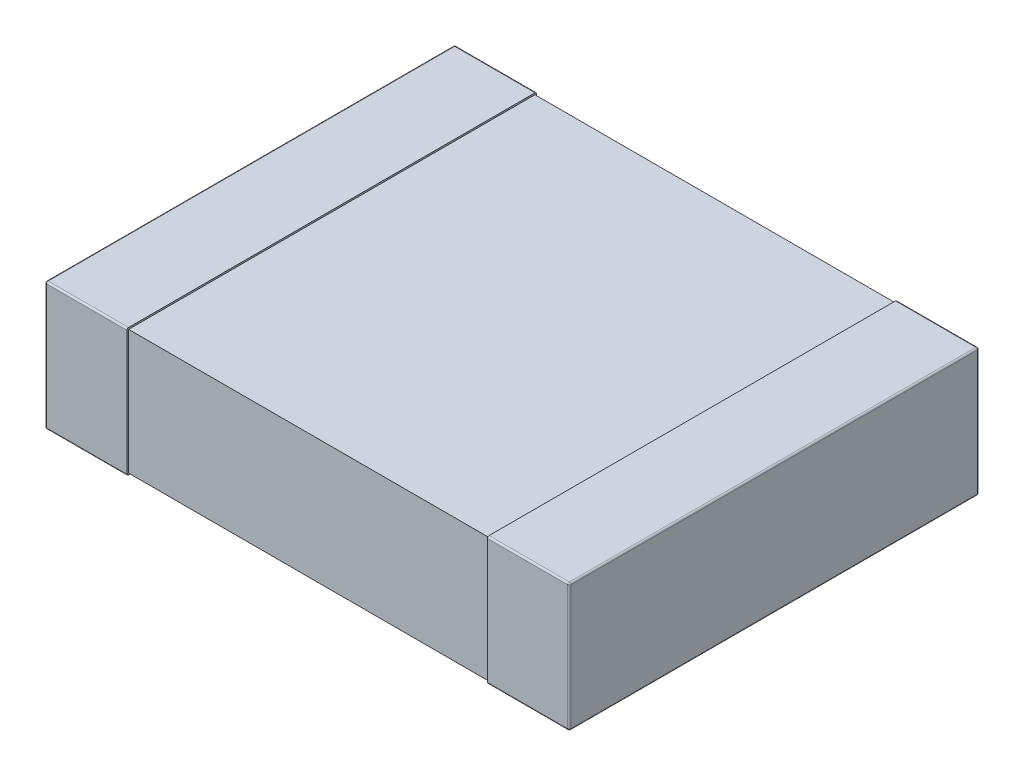
ISO-10303-21;
HEADER;
FILE_DESCRIPTION(('STEP AP214'),'2;1');
FILE_NAME('part.step','',(''),(''),'','','');
FILE_SCHEMA(('AUTOMOTIVE_DESIGN { 1 0 10303 214 1 1 1 1 }'));
ENDSEC;
DATA;
#1=APPLICATION_CONTEXT('core data for automotive mechanical design processes');
#2=APPLICATION_PROTOCOL_DEFINITION('international standard','automotive_design',2000,#1);
#3=PRODUCT_CONTEXT('',#1,'mechanical');
#4=PRODUCT('Part','Part','',(#3));
#5=PRODUCT_RELATED_PRODUCT_CATEGORY('part','',(#4));
#6=PRODUCT_DEFINITION_FORMATION('','',#4);
#7=PRODUCT_DEFINITION_CONTEXT('part definition',#1,'design');
#8=PRODUCT_DEFINITION('design','',#6,#7);
#9=PRODUCT_DEFINITION_SHAPE('','',#8);
#10=(LENGTH_UNIT() NAMED_UNIT(*) SI_UNIT(.MILLI.,.METRE.));
#11=(NAMED_UNIT(*) PLANE_ANGLE_UNIT() SI_UNIT($,.RADIAN.));
#12=(NAMED_UNIT(*) SI_UNIT($,.STERADIAN.) SOLID_ANGLE_UNIT());
#13=UNCERTAINTY_MEASURE_WITH_UNIT(LENGTH_MEASURE(1.E-05),#10,'distance_accuracy_value','');
#14=(GEOMETRIC_REPRESENTATION_CONTEXT(3) GLOBAL_UNCERTAINTY_ASSIGNED_CONTEXT((#13)) GLOBAL_UNIT_ASSIGNED_CONTEXT((#10,
#11,#12)) REPRESENTATION_CONTEXT('',''));
#15=CARTESIAN_POINT('',(0.,0.,0.));
#16=DIRECTION('',(0.,0.,1.));
#17=DIRECTION('',(1.,0.,0.));
#18=AXIS2_PLACEMENT_3D('',#15,#16,#17);
#19=CARTESIAN_POINT('',(-1.6,0.39,-1.25));
#20=DIRECTION('',(1.,0.,0.));
#21=DIRECTION('',(0.,0.,-1.));
#22=AXIS2_PLACEMENT_3D('',#19,#20,#21);
#23=PLANE('',#22);
#24=DIRECTION('',(0.,-1.,0.));
#25=VECTOR('',#24,1.);
#26=CARTESIAN_POINT('',(-1.6,0.39,-1.24));
#27=LINE('',#26,#25);
#28=CARTESIAN_POINT('',(-1.6,0.38,-1.24));
#29=VERTEX_POINT('',#28);
#30=CARTESIAN_POINT('',(-1.6,-0.38,-1.24));
#31=VERTEX_POINT('',#30);
#32=EDGE_CURVE('E350',#29,#31,#27,.T.);
#33=ORIENTED_EDGE('',*,*,#32,.T.);
#34=DIRECTION('',(0.,0.,1.));
#35=VECTOR('',#34,1.);
#36=CARTESIAN_POINT('',(-1.6,-0.38,-1.25));
#37=LINE('',#36,#35);
#38=CARTESIAN_POINT('',(-1.6,-0.38,1.24));
#39=VERTEX_POINT('',#38);
#40=EDGE_CURVE('E352',#31,#39,#37,.T.);
#41=ORIENTED_EDGE('',*,*,#40,.T.);
#42=DIRECTION('',(0.,-1.,0.));
#43=VECTOR('',#42,1.);
#44=CARTESIAN_POINT('',(-1.6,0.39,1.24));
#45=LINE('',#44,#43);
#46=CARTESIAN_POINT('',(-1.6,0.38,1.24));
#47=VERTEX_POINT('',#46);
#48=EDGE_CURVE('E348',#39,#47,#45,.F.);
#49=ORIENTED_EDGE('',*,*,#48,.T.);
#50=DIRECTION('',(0.,0.,1.));
#51=VECTOR('',#50,1.);
#52=CARTESIAN_POINT('',(-1.6,0.38,-1.25));
#53=LINE('',#52,#51);
#54=EDGE_CURVE('E346',#47,#29,#53,.F.);
#55=ORIENTED_EDGE('',*,*,#54,.T.);
#56=EDGE_LOOP('',(#33,#41,#49,#55));
#57=FACE_BOUND('',#56,.T.);
#58=ADVANCED_FACE('F35',(#57),#23,.F.);
#59=CARTESIAN_POINT('',(-1.6,0.39,1.25));
#60=DIRECTION('',(0.,0.,-1.));
#61=DIRECTION('',(-1.,0.,0.));
#62=AXIS2_PLACEMENT_3D('',#59,#60,#61);
#63=PLANE('',#62);
#64=DIRECTION('',(0.,-1.,0.));
#65=VECTOR('',#64,1.);
#66=CARTESIAN_POINT('',(-1.59,0.39,1.25));
#67=LINE('',#66,#65);
#68=CARTESIAN_POINT('',(-1.59,0.38,1.25));
#69=VERTEX_POINT('',#68);
#70=CARTESIAN_POINT('',(-1.59,-0.38,1.25));
#71=VERTEX_POINT('',#70);
#72=EDGE_CURVE('E378',#69,#71,#67,.T.);
#73=ORIENTED_EDGE('',*,*,#72,.T.);
#74=DIRECTION('',(1.,0.,0.));
#75=VECTOR('',#74,1.);
#76=CARTESIAN_POINT('',(-1.6,-0.38,1.25));
#77=LINE('',#76,#75);
#78=CARTESIAN_POINT('',(-1.1,-0.38,1.25));
#79=VERTEX_POINT('',#78);
#80=EDGE_CURVE('E380',#71,#79,#77,.T.);
#81=ORIENTED_EDGE('',*,*,#80,.T.);
#82=DIRECTION('',(0.,-1.,0.));
#83=VECTOR('',#82,1.);
#84=CARTESIAN_POINT('',(-1.1,0.39,1.25));
#85=LINE('',#84,#83);
#86=CARTESIAN_POINT('',(-1.1,0.38,1.25));
#87=VERTEX_POINT('',#86);
#88=EDGE_CURVE('E343',#87,#79,#85,.T.);
#89=ORIENTED_EDGE('',*,*,#88,.F.);
#90=DIRECTION('',(1.,0.,0.));
#91=VECTOR('',#90,1.);
#92=CARTESIAN_POINT('',(-1.6,0.38,1.25));
#93=LINE('',#92,#91);
#94=EDGE_CURVE('E376',#87,#69,#93,.F.);
#95=ORIENTED_EDGE('',*,*,#94,.T.);
#96=EDGE_LOOP('',(#73,#81,#89,#95));
#97=FACE_BOUND('',#96,.T.);
#98=ADVANCED_FACE('F449',(#97),#63,.F.);
#99=CARTESIAN_POINT('',(-1.1,0.39,-1.25));
#100=DIRECTION('',(-1.,0.,0.));
#101=DIRECTION('',(0.,0.,1.));
#102=AXIS2_PLACEMENT_3D('',#99,#100,#101);
#103=PLANE('',#102);
#104=DIRECTION('',(0.,1.,0.));
#105=VECTOR('',#104,1.);
#106=CARTESIAN_POINT('',(-1.1,0.38,-1.24));
#107=LINE('',#106,#105);
#108=CARTESIAN_POINT('',(-1.1,-0.38,-1.24));
#109=VERTEX_POINT('',#108);
#110=CARTESIAN_POINT('',(-1.1,0.38,-1.24));
#111=VERTEX_POINT('',#110);
#112=EDGE_CURVE('E209',#109,#111,#107,.T.);
#113=ORIENTED_EDGE('',*,*,#112,.F.);
#114=DIRECTION('',(0.,0.,-1.));
#115=VECTOR('',#114,1.);
#116=CARTESIAN_POINT('',(-1.1,-0.38,1.24));
#117=LINE('',#116,#115);
#118=CARTESIAN_POINT('',(-1.1,-0.38,1.24));
#119=VERTEX_POINT('',#118);
#120=EDGE_CURVE('E204',#119,#109,#117,.T.);
#121=ORIENTED_EDGE('',*,*,#120,.F.);
#122=DIRECTION('',(0.,-1.,0.));
#123=VECTOR('',#122,1.);
#124=CARTESIAN_POINT('',(-1.1,0.38,1.24));
#125=LINE('',#124,#123);
#126=CARTESIAN_POINT('',(-1.1,0.38,1.24));
#127=VERTEX_POINT('',#126);
#128=EDGE_CURVE('E325',#127,#119,#125,.T.);
#129=ORIENTED_EDGE('',*,*,#128,.F.);
#130=DIRECTION('',(0.,0.,1.));
#131=VECTOR('',#130,1.);
#132=CARTESIAN_POINT('',(-1.1,0.38,1.24));
#133=LINE('',#132,#131);
#134=EDGE_CURVE('E52',#111,#127,#133,.T.);
#135=ORIENTED_EDGE('',*,*,#134,.F.);
#136=EDGE_LOOP('',(#113,#121,#129,#135));
#137=FACE_BOUND('',#136,.T.);
#138=DIRECTION('',(0.,0.,-1.));
#139=VECTOR('',#138,1.);
#140=CARTESIAN_POINT('',(-1.1,-0.39,-1.25));
#141=LINE('',#140,#139);
#142=CARTESIAN_POINT('',(-1.1,-0.39,1.24));
#143=VERTEX_POINT('',#142);
#144=CARTESIAN_POINT('',(-1.1,-0.39,-1.24));
#145=VERTEX_POINT('',#144);
#146=EDGE_CURVE('E338',#143,#145,#141,.T.);
#147=ORIENTED_EDGE('',*,*,#146,.T.);
#148=CARTESIAN_POINT('',(-1.1,-0.38,-1.24));
#149=DIRECTION('',(-1.,0.,0.));
#150=DIRECTION('',(0.,0.,1.));
#151=AXIS2_PLACEMENT_3D('',#148,#149,#150);
#152=CIRCLE('',#151,0.01);
#153=CARTESIAN_POINT('',(-1.1,-0.38,-1.25));
#154=VERTEX_POINT('',#153);
#155=EDGE_CURVE('E374',#145,#154,#152,.F.);
#156=ORIENTED_EDGE('',*,*,#155,.T.);
#157=DIRECTION('',(0.,-1.,0.));
#158=VECTOR('',#157,1.);
#159=CARTESIAN_POINT('',(-1.1,0.39,-1.25));
#160=LINE('',#159,#158);
#161=CARTESIAN_POINT('',(-1.1,0.38,-1.25));
#162=VERTEX_POINT('',#161);
#163=EDGE_CURVE('E337',#162,#154,#160,.T.);
#164=ORIENTED_EDGE('',*,*,#163,.F.);
#165=CARTESIAN_POINT('',(-1.1,0.38,-1.24));
#166=DIRECTION('',(-1.,0.,0.));
#167=DIRECTION('',(0.,0.,1.));
#168=AXIS2_PLACEMENT_3D('',#165,#166,#167);
#169=CIRCLE('',#168,0.01);
#170=CARTESIAN_POINT('',(-1.1,0.39,-1.24));
#171=VERTEX_POINT('',#170);
#172=EDGE_CURVE('E370',#162,#171,#169,.F.);
#173=ORIENTED_EDGE('',*,*,#172,.T.);
#174=DIRECTION('',(0.,0.,-1.));
#175=VECTOR('',#174,1.);
#176=CARTESIAN_POINT('',(-1.1,0.39,-1.25));
#177=LINE('',#176,#175);
#178=CARTESIAN_POINT('',(-1.1,0.39,1.24));
#179=VERTEX_POINT('',#178);
#180=EDGE_CURVE('E335',#179,#171,#177,.T.);
#181=ORIENTED_EDGE('',*,*,#180,.F.);
#182=CARTESIAN_POINT('',(-1.1,0.38,1.24));
#183=DIRECTION('',(-1.,0.,0.));
#184=DIRECTION('',(0.,0.,1.));
#185=AXIS2_PLACEMENT_3D('',#182,#183,#184);
#186=CIRCLE('',#185,0.01);
#187=EDGE_CURVE('E368',#179,#87,#186,.F.);
#188=ORIENTED_EDGE('',*,*,#187,.T.);
#189=ORIENTED_EDGE('',*,*,#88,.T.);
#190=CARTESIAN_POINT('',(-1.1,-0.38,1.24));
#191=DIRECTION('',(-1.,0.,0.));
#192=DIRECTION('',(0.,0.,1.));
#193=AXIS2_PLACEMENT_3D('',#190,#191,#192);
#194=CIRCLE('',#193,0.01);
#195=EDGE_CURVE('E372',#79,#143,#194,.F.);
#196=ORIENTED_EDGE('',*,*,#195,.T.);
#197=EDGE_LOOP('',(#147,#156,#164,#173,#181,#188,#189,#196));
#198=FACE_BOUND('',#197,.T.);
#199=ADVANCED_FACE('F446',(#137,#198),#103,.F.);
#200=CARTESIAN_POINT('',(-1.6,0.39,-1.25));
#201=DIRECTION('',(0.,0.,1.));
#202=DIRECTION('',(1.,0.,0.));
#203=AXIS2_PLACEMENT_3D('',#200,#201,#202);
#204=PLANE('',#203);
#205=ORIENTED_EDGE('',*,*,#163,.T.);
#206=DIRECTION('',(-1.,0.,0.));
#207=VECTOR('',#206,1.);
#208=CARTESIAN_POINT('',(-1.6,-0.38,-1.25));
#209=LINE('',#208,#207);
#210=CARTESIAN_POINT('',(-1.59,-0.38,-1.25));
#211=VERTEX_POINT('',#210);
#212=EDGE_CURVE('E366',#154,#211,#209,.T.);
#213=ORIENTED_EDGE('',*,*,#212,.T.);
#214=DIRECTION('',(0.,-1.,0.));
#215=VECTOR('',#214,1.);
#216=CARTESIAN_POINT('',(-1.59,0.39,-1.25));
#217=LINE('',#216,#215);
#218=CARTESIAN_POINT('',(-1.59,0.38,-1.25));
#219=VERTEX_POINT('',#218);
#220=EDGE_CURVE('E364',#211,#219,#217,.F.);
#221=ORIENTED_EDGE('',*,*,#220,.T.);
#222=DIRECTION('',(-1.,0.,0.));
#223=VECTOR('',#222,1.);
#224=CARTESIAN_POINT('',(-1.1,0.38,-1.25));
#225=LINE('',#224,#223);
#226=EDGE_CURVE('E362',#219,#162,#225,.F.);
#227=ORIENTED_EDGE('',*,*,#226,.T.);
#228=EDGE_LOOP('',(#205,#213,#221,#227));
#229=FACE_BOUND('',#228,.T.);
#230=ADVANCED_FACE('F475',(#229),#204,.F.);
#231=CARTESIAN_POINT('',(-1.6,0.39,1.25));
#232=DIRECTION('',(0.,1.,0.));
#233=DIRECTION('',(0.,0.,1.));
#234=AXIS2_PLACEMENT_3D('',#231,#232,#233);
#235=PLANE('',#234);
#236=ORIENTED_EDGE('',*,*,#180,.T.);
#237=DIRECTION('',(-1.,0.,0.));
#238=VECTOR('',#237,1.);
#239=CARTESIAN_POINT('',(-1.6,0.39,-1.24));
#240=LINE('',#239,#238);
#241=CARTESIAN_POINT('',(-1.59,0.39,-1.24));
#242=VERTEX_POINT('',#241);
#243=EDGE_CURVE('E11',#171,#242,#240,.T.);
#244=ORIENTED_EDGE('',*,*,#243,.T.);
#245=DIRECTION('',(0.,0.,1.));
#246=VECTOR('',#245,1.);
#247=CARTESIAN_POINT('',(-1.59,0.39,1.25));
#248=LINE('',#247,#246);
#249=CARTESIAN_POINT('',(-1.59,0.39,1.24));
#250=VERTEX_POINT('',#249);
#251=EDGE_CURVE('E44',#242,#250,#248,.T.);
#252=ORIENTED_EDGE('',*,*,#251,.T.);
#253=DIRECTION('',(1.,0.,0.));
#254=VECTOR('',#253,1.);
#255=CARTESIAN_POINT('',(-1.1,0.39,1.24));
#256=LINE('',#255,#254);
#257=EDGE_CURVE('E382',#250,#179,#256,.T.);
#258=ORIENTED_EDGE('',*,*,#257,.T.);
#259=EDGE_LOOP('',(#236,#244,#252,#258));
#260=FACE_BOUND('',#259,.T.);
#261=ADVANCED_FACE('F436',(#260),#235,.T.);
#262=CARTESIAN_POINT('',(-1.6,-0.39,1.25));
#263=DIRECTION('',(0.,1.,0.));
#264=DIRECTION('',(0.,0.,1.));
#265=AXIS2_PLACEMENT_3D('',#262,#263,#264);
#266=PLANE('',#265);
#267=DIRECTION('',(0.,0.,1.));
#268=VECTOR('',#267,1.);
#269=CARTESIAN_POINT('',(-1.59,-0.39,1.25));
#270=LINE('',#269,#268);
#271=CARTESIAN_POINT('',(-1.59,-0.39,1.24));
#272=VERTEX_POINT('',#271);
#273=CARTESIAN_POINT('',(-1.59,-0.39,-1.24));
#274=VERTEX_POINT('',#273);
#275=EDGE_CURVE('E357',#272,#274,#270,.F.);
#276=ORIENTED_EDGE('',*,*,#275,.T.);
#277=DIRECTION('',(-1.,0.,0.));
#278=VECTOR('',#277,1.);
#279=CARTESIAN_POINT('',(-1.6,-0.39,-1.24));
#280=LINE('',#279,#278);
#281=EDGE_CURVE('E360',#274,#145,#280,.F.);
#282=ORIENTED_EDGE('',*,*,#281,.T.);
#283=ORIENTED_EDGE('',*,*,#146,.F.);
#284=DIRECTION('',(1.,0.,0.));
#285=VECTOR('',#284,1.);
#286=CARTESIAN_POINT('',(-1.6,-0.39,1.24));
#287=LINE('',#286,#285);
#288=EDGE_CURVE('E355',#143,#272,#287,.F.);
#289=ORIENTED_EDGE('',*,*,#288,.T.);
#290=EDGE_LOOP('',(#276,#282,#283,#289));
#291=FACE_BOUND('',#290,.T.);
#292=ADVANCED_FACE('F466',(#291),#266,.F.);
#293=CARTESIAN_POINT('',(-1.6,0.38,-1.24));
#294=DIRECTION('',(1.,0.,0.));
#295=DIRECTION('',(0.,0.,-1.));
#296=AXIS2_PLACEMENT_3D('',#293,#294,#295);
#297=CYLINDRICAL_SURFACE('',#296,0.01);
#298=ORIENTED_EDGE('',*,*,#172,.F.);
#299=ORIENTED_EDGE('',*,*,#226,.F.);
#300=CARTESIAN_POINT('',(-1.59,0.38,-1.24));
#301=DIRECTION('',(-1.,0.,0.));
#302=DIRECTION('',(0.,0.,1.));
#303=AXIS2_PLACEMENT_3D('',#300,#301,#302);
#304=CIRCLE('',#303,0.01);
#305=EDGE_CURVE('E39',#242,#219,#304,.T.);
#306=ORIENTED_EDGE('',*,*,#305,.F.);
#307=ORIENTED_EDGE('',*,*,#243,.F.);
#308=EDGE_LOOP('',(#298,#299,#306,#307));
#309=FACE_BOUND('',#308,.T.);
#310=ADVANCED_FACE('F37',(#309),#297,.T.);
#311=CARTESIAN_POINT('',(-1.59,0.38,1.25));
#312=DIRECTION('',(0.,0.,-1.));
#313=DIRECTION('',(-1.,0.,0.));
#314=AXIS2_PLACEMENT_3D('',#311,#312,#313);
#315=CYLINDRICAL_SURFACE('',#314,0.01);
#316=CARTESIAN_POINT('',(-1.59,0.38,1.24));
#317=DIRECTION('',(0.,0.,1.));
#318=DIRECTION('',(1.,0.,0.));
#319=AXIS2_PLACEMENT_3D('',#316,#317,#318);
#320=CIRCLE('',#319,0.01);
#321=EDGE_CURVE('E409',#250,#47,#320,.T.);
#322=ORIENTED_EDGE('',*,*,#321,.F.);
#323=ORIENTED_EDGE('',*,*,#251,.F.);
#324=CARTESIAN_POINT('',(-1.59,0.38,-1.24));
#325=DIRECTION('',(0.,0.,-1.));
#326=DIRECTION('',(-1.,0.,0.));
#327=AXIS2_PLACEMENT_3D('',#324,#325,#326);
#328=CIRCLE('',#327,0.01);
#329=EDGE_CURVE('E411',#29,#242,#328,.T.);
#330=ORIENTED_EDGE('',*,*,#329,.F.);
#331=ORIENTED_EDGE('',*,*,#54,.F.);
#332=EDGE_LOOP('',(#322,#323,#330,#331));
#333=FACE_BOUND('',#332,.T.);
#334=ADVANCED_FACE('F434',(#333),#315,.T.);
#335=CARTESIAN_POINT('',(-1.6,0.38,1.24));
#336=DIRECTION('',(-1.,0.,0.));
#337=DIRECTION('',(0.,0.,1.));
#338=AXIS2_PLACEMENT_3D('',#335,#336,#337);
#339=CYLINDRICAL_SURFACE('',#338,0.01);
#340=ORIENTED_EDGE('',*,*,#187,.F.);
#341=ORIENTED_EDGE('',*,*,#257,.F.);
#342=CARTESIAN_POINT('',(-1.59,0.38,1.24));
#343=DIRECTION('',(-1.,0.,0.));
#344=DIRECTION('',(0.,0.,1.));
#345=AXIS2_PLACEMENT_3D('',#342,#343,#344);
#346=CIRCLE('',#345,0.01);
#347=EDGE_CURVE('E406',#69,#250,#346,.T.);
#348=ORIENTED_EDGE('',*,*,#347,.F.);
#349=ORIENTED_EDGE('',*,*,#94,.F.);
#350=EDGE_LOOP('',(#340,#341,#348,#349));
#351=FACE_BOUND('',#350,.T.);
#352=ADVANCED_FACE('F441',(#351),#339,.T.);
#353=CARTESIAN_POINT('',(-1.59,0.38,-1.24));
#354=DIRECTION('',(0.,0.,1.));
#355=DIRECTION('',(1.,0.,0.));
#356=AXIS2_PLACEMENT_3D('',#353,#354,#355);
#357=SPHERICAL_SURFACE('',#356,0.01);
#358=ORIENTED_EDGE('',*,*,#329,.T.);
#359=ORIENTED_EDGE('',*,*,#305,.T.);
#360=CARTESIAN_POINT('',(-1.59,0.38,-1.24));
#361=DIRECTION('',(0.,1.,0.));
#362=DIRECTION('',(0.,0.,1.));
#363=AXIS2_PLACEMENT_3D('',#360,#361,#362);
#364=CIRCLE('',#363,0.01);
#365=EDGE_CURVE('E403',#29,#219,#364,.F.);
#366=ORIENTED_EDGE('',*,*,#365,.F.);
#367=EDGE_LOOP('',(#358,#359,#366));
#368=FACE_BOUND('',#367,.T.);
#369=ADVANCED_FACE('F418',(#368),#357,.T.);
#370=CARTESIAN_POINT('',(-1.59,0.38,1.24));
#371=DIRECTION('',(0.,0.,1.));
#372=DIRECTION('',(1.,0.,0.));
#373=AXIS2_PLACEMENT_3D('',#370,#371,#372);
#374=SPHERICAL_SURFACE('',#373,0.01);
#375=ORIENTED_EDGE('',*,*,#347,.T.);
#376=ORIENTED_EDGE('',*,*,#321,.T.);
#377=CARTESIAN_POINT('',(-1.59,0.38,1.24));
#378=DIRECTION('',(0.,1.,0.));
#379=DIRECTION('',(0.,0.,1.));
#380=AXIS2_PLACEMENT_3D('',#377,#378,#379);
#381=CIRCLE('',#380,0.01);
#382=EDGE_CURVE('E400',#69,#47,#381,.F.);
#383=ORIENTED_EDGE('',*,*,#382,.F.);
#384=EDGE_LOOP('',(#375,#376,#383));
#385=FACE_BOUND('',#384,.T.);
#386=ADVANCED_FACE('F507',(#385),#374,.T.);
#387=CARTESIAN_POINT('',(-1.6,-0.38,-1.24));
#388=DIRECTION('',(-1.,0.,0.));
#389=DIRECTION('',(0.,0.,1.));
#390=AXIS2_PLACEMENT_3D('',#387,#388,#389);
#391=CYLINDRICAL_SURFACE('',#390,0.01);
#392=ORIENTED_EDGE('',*,*,#155,.F.);
#393=ORIENTED_EDGE('',*,*,#281,.F.);
#394=CARTESIAN_POINT('',(-1.59,-0.38,-1.24));
#395=DIRECTION('',(-1.,0.,0.));
#396=DIRECTION('',(0.,0.,1.));
#397=AXIS2_PLACEMENT_3D('',#394,#395,#396);
#398=CIRCLE('',#397,0.01);
#399=EDGE_CURVE('E397',#211,#274,#398,.T.);
#400=ORIENTED_EDGE('',*,*,#399,.F.);
#401=ORIENTED_EDGE('',*,*,#212,.F.);
#402=EDGE_LOOP('',(#392,#393,#400,#401));
#403=FACE_BOUND('',#402,.T.);
#404=ADVANCED_FACE('F473',(#403),#391,.T.);
#405=CARTESIAN_POINT('',(-1.59,0.39,-1.24));
#406=DIRECTION('',(0.,-1.,0.));
#407=DIRECTION('',(0.,0.,-1.));
#408=AXIS2_PLACEMENT_3D('',#405,#406,#407);
#409=CYLINDRICAL_SURFACE('',#408,0.01);
#410=ORIENTED_EDGE('',*,*,#365,.T.);
#411=ORIENTED_EDGE('',*,*,#220,.F.);
#412=CARTESIAN_POINT('',(-1.59,-0.38,-1.24));
#413=DIRECTION('',(0.,-1.,0.));
#414=DIRECTION('',(0.,0.,-1.));
#415=AXIS2_PLACEMENT_3D('',#412,#413,#414);
#416=CIRCLE('',#415,0.01);
#417=EDGE_CURVE('E394',#31,#211,#416,.T.);
#418=ORIENTED_EDGE('',*,*,#417,.F.);
#419=ORIENTED_EDGE('',*,*,#32,.F.);
#420=EDGE_LOOP('',(#410,#411,#418,#419));
#421=FACE_BOUND('',#420,.T.);
#422=ADVANCED_FACE('F424',(#421),#409,.T.);
#423=CARTESIAN_POINT('',(-1.59,0.39,1.24));
#424=DIRECTION('',(0.,-1.,0.));
#425=DIRECTION('',(0.,0.,-1.));
#426=AXIS2_PLACEMENT_3D('',#423,#424,#425);
#427=CYLINDRICAL_SURFACE('',#426,0.01);
#428=ORIENTED_EDGE('',*,*,#382,.T.);
#429=ORIENTED_EDGE('',*,*,#48,.F.);
#430=CARTESIAN_POINT('',(-1.59,-0.38,1.24));
#431=DIRECTION('',(0.,-1.,0.));
#432=DIRECTION('',(0.,0.,-1.));
#433=AXIS2_PLACEMENT_3D('',#430,#431,#432);
#434=CIRCLE('',#433,0.01);
#435=EDGE_CURVE('E391',#71,#39,#434,.T.);
#436=ORIENTED_EDGE('',*,*,#435,.F.);
#437=ORIENTED_EDGE('',*,*,#72,.F.);
#438=EDGE_LOOP('',(#428,#429,#436,#437));
#439=FACE_BOUND('',#438,.T.);
#440=ADVANCED_FACE('F459',(#439),#427,.T.);
#441=CARTESIAN_POINT('',(-1.6,-0.38,1.24));
#442=DIRECTION('',(1.,0.,0.));
#443=DIRECTION('',(0.,0.,-1.));
#444=AXIS2_PLACEMENT_3D('',#441,#442,#443);
#445=CYLINDRICAL_SURFACE('',#444,0.01);
#446=ORIENTED_EDGE('',*,*,#195,.F.);
#447=ORIENTED_EDGE('',*,*,#80,.F.);
#448=CARTESIAN_POINT('',(-1.59,-0.38,1.24));
#449=DIRECTION('',(-1.,0.,0.));
#450=DIRECTION('',(0.,0.,1.));
#451=AXIS2_PLACEMENT_3D('',#448,#449,#450);
#452=CIRCLE('',#451,0.01);
#453=EDGE_CURVE('E388',#272,#71,#452,.T.);
#454=ORIENTED_EDGE('',*,*,#453,.F.);
#455=ORIENTED_EDGE('',*,*,#288,.F.);
#456=EDGE_LOOP('',(#446,#447,#454,#455));
#457=FACE_BOUND('',#456,.T.);
#458=ADVANCED_FACE('F455',(#457),#445,.T.);
#459=CARTESIAN_POINT('',(-1.59,-0.38,-1.24));
#460=DIRECTION('',(0.,0.,1.));
#461=DIRECTION('',(1.,0.,0.));
#462=AXIS2_PLACEMENT_3D('',#459,#460,#461);
#463=SPHERICAL_SURFACE('',#462,0.01);
#464=ORIENTED_EDGE('',*,*,#417,.T.);
#465=ORIENTED_EDGE('',*,*,#399,.T.);
#466=CARTESIAN_POINT('',(-1.59,-0.38,-1.24));
#467=DIRECTION('',(0.,0.,-1.));
#468=DIRECTION('',(-1.,0.,0.));
#469=AXIS2_PLACEMENT_3D('',#466,#467,#468);
#470=CIRCLE('',#469,0.01);
#471=EDGE_CURVE('E386',#31,#274,#470,.F.);
#472=ORIENTED_EDGE('',*,*,#471,.F.);
#473=EDGE_LOOP('',(#464,#465,#472));
#474=FACE_BOUND('',#473,.T.);
#475=ADVANCED_FACE('F495',(#474),#463,.T.);
#476=CARTESIAN_POINT('',(-1.59,-0.38,1.24));
#477=DIRECTION('',(0.,0.,1.));
#478=DIRECTION('',(1.,0.,0.));
#479=AXIS2_PLACEMENT_3D('',#476,#477,#478);
#480=SPHERICAL_SURFACE('',#479,0.01);
#481=ORIENTED_EDGE('',*,*,#453,.T.);
#482=ORIENTED_EDGE('',*,*,#435,.T.);
#483=CARTESIAN_POINT('',(-1.59,-0.38,1.24));
#484=DIRECTION('',(0.,0.,1.));
#485=DIRECTION('',(1.,0.,0.));
#486=AXIS2_PLACEMENT_3D('',#483,#484,#485);
#487=CIRCLE('',#486,0.01);
#488=EDGE_CURVE('E334',#272,#39,#487,.F.);
#489=ORIENTED_EDGE('',*,*,#488,.F.);
#490=EDGE_LOOP('',(#481,#482,#489));
#491=FACE_BOUND('',#490,.T.);
#492=ADVANCED_FACE('F462',(#491),#480,.T.);
#493=CARTESIAN_POINT('',(-1.59,-0.38,-1.25));
#494=DIRECTION('',(0.,0.,1.));
#495=DIRECTION('',(1.,0.,0.));
#496=AXIS2_PLACEMENT_3D('',#493,#494,#495);
#497=CYLINDRICAL_SURFACE('',#496,0.01);
#498=ORIENTED_EDGE('',*,*,#471,.T.);
#499=ORIENTED_EDGE('',*,*,#275,.F.);
#500=ORIENTED_EDGE('',*,*,#488,.T.);
#501=ORIENTED_EDGE('',*,*,#40,.F.);
#502=EDGE_LOOP('',(#498,#499,#500,#501));
#503=FACE_BOUND('',#502,.T.);
#504=ADVANCED_FACE('F464',(#503),#497,.T.);
#505=CARTESIAN_POINT('',(-3.69383885389976,-0.38,1.24));
#506=DIRECTION('',(0.,-1.,0.));
#507=DIRECTION('',(0.,0.,-1.));
#508=AXIS2_PLACEMENT_3D('',#505,#506,#507);
#509=PLANE('',#508);
#510=DIRECTION('',(1.,0.,0.));
#511=VECTOR('',#510,1.);
#512=CARTESIAN_POINT('',(-3.69383885389976,-0.38,1.24));
#513=LINE('',#512,#511);
#514=CARTESIAN_POINT('',(1.1,-0.38,1.24));
#515=VERTEX_POINT('',#514);
#516=EDGE_CURVE('E327',#119,#515,#513,.T.);
#517=ORIENTED_EDGE('',*,*,#516,.F.);
#518=ORIENTED_EDGE('',*,*,#120,.T.);
#519=DIRECTION('',(1.,0.,0.));
#520=VECTOR('',#519,1.);
#521=CARTESIAN_POINT('',(-3.69383885389976,-0.38,-1.24));
#522=LINE('',#521,#520);
#523=CARTESIAN_POINT('',(1.1,-0.38,-1.24));
#524=VERTEX_POINT('',#523);
#525=EDGE_CURVE('E197',#109,#524,#522,.T.);
#526=ORIENTED_EDGE('',*,*,#525,.T.);
#527=DIRECTION('',(0.,0.,-1.));
#528=VECTOR('',#527,1.);
#529=CARTESIAN_POINT('',(1.1,-0.38,1.24));
#530=LINE('',#529,#528);
#531=EDGE_CURVE('E201',#515,#524,#530,.T.);
#532=ORIENTED_EDGE('',*,*,#531,.F.);
#533=EDGE_LOOP('',(#517,#518,#526,#532));
#534=FACE_BOUND('',#533,.T.);
#535=ADVANCED_FACE('F200',(#534),#509,.T.);
#536=CARTESIAN_POINT('',(-3.69383885389976,0.38,-1.24));
#537=DIRECTION('',(0.,0.,-1.));
#538=DIRECTION('',(-1.,0.,0.));
#539=AXIS2_PLACEMENT_3D('',#536,#537,#538);
#540=PLANE('',#539);
#541=ORIENTED_EDGE('',*,*,#525,.F.);
#542=ORIENTED_EDGE('',*,*,#112,.T.);
#543=DIRECTION('',(1.,0.,0.));
#544=VECTOR('',#543,1.);
#545=CARTESIAN_POINT('',(-3.69383885389976,0.38,-1.24));
#546=LINE('',#545,#544);
#547=CARTESIAN_POINT('',(1.1,0.38,-1.24));
#548=VERTEX_POINT('',#547);
#549=EDGE_CURVE('E221',#111,#548,#546,.T.);
#550=ORIENTED_EDGE('',*,*,#549,.T.);
#551=DIRECTION('',(0.,1.,0.));
#552=VECTOR('',#551,1.);
#553=CARTESIAN_POINT('',(1.1,0.38,-1.24));
#554=LINE('',#553,#552);
#555=EDGE_CURVE('E216',#524,#548,#554,.T.);
#556=ORIENTED_EDGE('',*,*,#555,.F.);
#557=EDGE_LOOP('',(#541,#542,#550,#556));
#558=FACE_BOUND('',#557,.T.);
#559=ADVANCED_FACE('F220',(#558),#540,.T.);
#560=CARTESIAN_POINT('',(-3.69383885389976,0.38,1.24));
#561=DIRECTION('',(0.,1.,0.));
#562=DIRECTION('',(0.,0.,1.));
#563=AXIS2_PLACEMENT_3D('',#560,#561,#562);
#564=PLANE('',#563);
#565=ORIENTED_EDGE('',*,*,#549,.F.);
#566=ORIENTED_EDGE('',*,*,#134,.T.);
#567=DIRECTION('',(1.,0.,0.));
#568=VECTOR('',#567,1.);
#569=CARTESIAN_POINT('',(-3.69383885389976,0.38,1.24));
#570=LINE('',#569,#568);
#571=CARTESIAN_POINT('',(1.1,0.38,1.24));
#572=VERTEX_POINT('',#571);
#573=EDGE_CURVE('E328',#127,#572,#570,.T.);
#574=ORIENTED_EDGE('',*,*,#573,.T.);
#575=DIRECTION('',(0.,0.,1.));
#576=VECTOR('',#575,1.);
#577=CARTESIAN_POINT('',(1.1,0.38,1.24));
#578=LINE('',#577,#576);
#579=EDGE_CURVE('E223',#548,#572,#578,.T.);
#580=ORIENTED_EDGE('',*,*,#579,.F.);
#581=EDGE_LOOP('',(#565,#566,#574,#580));
#582=FACE_BOUND('',#581,.T.);
#583=ADVANCED_FACE('F567',(#582),#564,.T.);
#584=CARTESIAN_POINT('',(-3.69383885389976,0.38,1.24));
#585=DIRECTION('',(0.,0.,1.));
#586=DIRECTION('',(1.,0.,0.));
#587=AXIS2_PLACEMENT_3D('',#584,#585,#586);
#588=PLANE('',#587);
#589=ORIENTED_EDGE('',*,*,#573,.F.);
#590=ORIENTED_EDGE('',*,*,#128,.T.);
#591=ORIENTED_EDGE('',*,*,#516,.T.);
#592=DIRECTION('',(0.,-1.,0.));
#593=VECTOR('',#592,1.);
#594=CARTESIAN_POINT('',(1.1,0.38,1.24));
#595=LINE('',#594,#593);
#596=EDGE_CURVE('E218',#572,#515,#595,.T.);
#597=ORIENTED_EDGE('',*,*,#596,.F.);
#598=EDGE_LOOP('',(#589,#590,#591,#597));
#599=FACE_BOUND('',#598,.T.);
#600=ADVANCED_FACE('F574',(#599),#588,.T.);
#601=CARTESIAN_POINT('',(1.6,0.39,-1.25));
#602=DIRECTION('',(-1.,0.,0.));
#603=DIRECTION('',(0.,0.,-1.));
#604=AXIS2_PLACEMENT_3D('',#601,#602,#603);
#605=PLANE('',#604);
#606=DIRECTION('',(0.,-1.,0.));
#607=VECTOR('',#606,1.);
#608=CARTESIAN_POINT('',(1.6,0.39,-1.24));
#609=LINE('',#608,#607);
#610=CARTESIAN_POINT('',(1.6,0.38,-1.24));
#611=VERTEX_POINT('',#610);
#612=CARTESIAN_POINT('',(1.6,-0.38,-1.24));
#613=VERTEX_POINT('',#612);
#614=EDGE_CURVE('E247',#611,#613,#609,.T.);
#615=ORIENTED_EDGE('',*,*,#614,.F.);
#616=DIRECTION('',(0.,0.,1.));
#617=VECTOR('',#616,1.);
#618=CARTESIAN_POINT('',(1.6,0.38,-1.25));
#619=LINE('',#618,#617);
#620=CARTESIAN_POINT('',(1.6,0.38,1.24));
#621=VERTEX_POINT('',#620);
#622=EDGE_CURVE('E241',#621,#611,#619,.F.);
#623=ORIENTED_EDGE('',*,*,#622,.F.);
#624=DIRECTION('',(0.,-1.,0.));
#625=VECTOR('',#624,1.);
#626=CARTESIAN_POINT('',(1.6,0.39,1.24));
#627=LINE('',#626,#625);
#628=CARTESIAN_POINT('',(1.6,-0.38,1.24));
#629=VERTEX_POINT('',#628);
#630=EDGE_CURVE('E244',#629,#621,#627,.F.);
#631=ORIENTED_EDGE('',*,*,#630,.F.);
#632=DIRECTION('',(0.,0.,1.));
#633=VECTOR('',#632,1.);
#634=CARTESIAN_POINT('',(1.6,-0.38,-1.25));
#635=LINE('',#634,#633);
#636=EDGE_CURVE('E250',#613,#629,#635,.T.);
#637=ORIENTED_EDGE('',*,*,#636,.F.);
#638=EDGE_LOOP('',(#615,#623,#631,#637));
#639=FACE_BOUND('',#638,.T.);
#640=ADVANCED_FACE('F581',(#639),#605,.F.);
#641=CARTESIAN_POINT('',(1.6,0.39,1.25));
#642=DIRECTION('',(0.,0.,-1.));
#643=DIRECTION('',(1.,0.,0.));
#644=AXIS2_PLACEMENT_3D('',#641,#642,#643);
#645=PLANE('',#644);
#646=DIRECTION('',(0.,-1.,0.));
#647=VECTOR('',#646,1.);
#648=CARTESIAN_POINT('',(1.59,0.39,1.25));
#649=LINE('',#648,#647);
#650=CARTESIAN_POINT('',(1.59,0.38,1.25));
#651=VERTEX_POINT('',#650);
#652=CARTESIAN_POINT('',(1.59,-0.38,1.25));
#653=VERTEX_POINT('',#652);
#654=EDGE_CURVE('E283',#651,#653,#649,.T.);
#655=ORIENTED_EDGE('',*,*,#654,.F.);
#656=DIRECTION('',(-1.,0.,0.));
#657=VECTOR('',#656,1.);
#658=CARTESIAN_POINT('',(1.6,0.38,1.25));
#659=LINE('',#658,#657);
#660=CARTESIAN_POINT('',(1.1,0.38,1.25));
#661=VERTEX_POINT('',#660);
#662=EDGE_CURVE('E280',#661,#651,#659,.F.);
#663=ORIENTED_EDGE('',*,*,#662,.F.);
#664=DIRECTION('',(0.,-1.,0.));
#665=VECTOR('',#664,1.);
#666=CARTESIAN_POINT('',(1.1,0.39,1.25));
#667=LINE('',#666,#665);
#668=CARTESIAN_POINT('',(1.1,-0.38,1.25));
#669=VERTEX_POINT('',#668);
#670=EDGE_CURVE('E238',#661,#669,#667,.T.);
#671=ORIENTED_EDGE('',*,*,#670,.T.);
#672=DIRECTION('',(-1.,0.,0.));
#673=VECTOR('',#672,1.);
#674=CARTESIAN_POINT('',(1.6,-0.38,1.25));
#675=LINE('',#674,#673);
#676=EDGE_CURVE('E286',#653,#669,#675,.T.);
#677=ORIENTED_EDGE('',*,*,#676,.F.);
#678=EDGE_LOOP('',(#655,#663,#671,#677));
#679=FACE_BOUND('',#678,.T.);
#680=ADVANCED_FACE('F590',(#679),#645,.F.);
#681=CARTESIAN_POINT('',(1.1,0.39,-1.25));
#682=DIRECTION('',(1.,0.,0.));
#683=DIRECTION('',(0.,0.,1.));
#684=AXIS2_PLACEMENT_3D('',#681,#682,#683);
#685=PLANE('',#684);
#686=ORIENTED_EDGE('',*,*,#555,.T.);
#687=ORIENTED_EDGE('',*,*,#579,.T.);
#688=ORIENTED_EDGE('',*,*,#596,.T.);
#689=ORIENTED_EDGE('',*,*,#531,.T.);
#690=EDGE_LOOP('',(#686,#687,#688,#689));
#691=FACE_BOUND('',#690,.T.);
#692=DIRECTION('',(0.,0.,-1.));
#693=VECTOR('',#692,1.);
#694=CARTESIAN_POINT('',(1.1,-0.39,-1.25));
#695=LINE('',#694,#693);
#696=CARTESIAN_POINT('',(1.1,-0.39,1.24));
#697=VERTEX_POINT('',#696);
#698=CARTESIAN_POINT('',(1.1,-0.39,-1.24));
#699=VERTEX_POINT('',#698);
#700=EDGE_CURVE('E232',#697,#699,#695,.T.);
#701=ORIENTED_EDGE('',*,*,#700,.F.);
#702=CARTESIAN_POINT('',(1.1,-0.38,1.24));
#703=DIRECTION('',(-1.,0.,0.));
#704=DIRECTION('',(0.,0.,1.));
#705=AXIS2_PLACEMENT_3D('',#702,#703,#704);
#706=CIRCLE('',#705,0.01);
#707=EDGE_CURVE('E274',#669,#697,#706,.F.);
#708=ORIENTED_EDGE('',*,*,#707,.F.);
#709=ORIENTED_EDGE('',*,*,#670,.F.);
#710=CARTESIAN_POINT('',(1.1,0.38,1.24));
#711=DIRECTION('',(-1.,0.,0.));
#712=DIRECTION('',(0.,0.,1.));
#713=AXIS2_PLACEMENT_3D('',#710,#711,#712);
#714=CIRCLE('',#713,0.01);
#715=CARTESIAN_POINT('',(1.1,0.39,1.24));
#716=VERTEX_POINT('',#715);
#717=EDGE_CURVE('E269',#716,#661,#714,.F.);
#718=ORIENTED_EDGE('',*,*,#717,.F.);
#719=DIRECTION('',(0.,0.,-1.));
#720=VECTOR('',#719,1.);
#721=CARTESIAN_POINT('',(1.1,0.39,-1.25));
#722=LINE('',#721,#720);
#723=CARTESIAN_POINT('',(1.1,0.39,-1.24));
#724=VERTEX_POINT('',#723);
#725=EDGE_CURVE('E228',#716,#724,#722,.T.);
#726=ORIENTED_EDGE('',*,*,#725,.T.);
#727=CARTESIAN_POINT('',(1.1,0.38,-1.24));
#728=DIRECTION('',(-1.,0.,0.));
#729=DIRECTION('',(0.,0.,1.));
#730=AXIS2_PLACEMENT_3D('',#727,#728,#729);
#731=CIRCLE('',#730,0.01);
#732=CARTESIAN_POINT('',(1.1,0.38,-1.25));
#733=VERTEX_POINT('',#732);
#734=EDGE_CURVE('E271',#733,#724,#731,.F.);
#735=ORIENTED_EDGE('',*,*,#734,.F.);
#736=DIRECTION('',(0.,-1.,0.));
#737=VECTOR('',#736,1.);
#738=CARTESIAN_POINT('',(1.1,0.39,-1.25));
#739=LINE('',#738,#737);
#740=CARTESIAN_POINT('',(1.1,-0.38,-1.25));
#741=VERTEX_POINT('',#740);
#742=EDGE_CURVE('E231',#733,#741,#739,.T.);
#743=ORIENTED_EDGE('',*,*,#742,.T.);
#744=CARTESIAN_POINT('',(1.1,-0.38,-1.24));
#745=DIRECTION('',(-1.,0.,0.));
#746=DIRECTION('',(0.,0.,1.));
#747=AXIS2_PLACEMENT_3D('',#744,#745,#746);
#748=CIRCLE('',#747,0.01);
#749=EDGE_CURVE('E277',#699,#741,#748,.F.);
#750=ORIENTED_EDGE('',*,*,#749,.F.);
#751=EDGE_LOOP('',(#701,#708,#709,#718,#726,#735,#743,#750));
#752=FACE_BOUND('',#751,.T.);
#753=ADVANCED_FACE('F213',(#691,#752),#685,.F.);
#754=CARTESIAN_POINT('',(1.6,0.39,-1.25));
#755=DIRECTION('',(0.,0.,1.));
#756=DIRECTION('',(-1.,0.,0.));
#757=AXIS2_PLACEMENT_3D('',#754,#755,#756);
#758=PLANE('',#757);
#759=ORIENTED_EDGE('',*,*,#742,.F.);
#760=DIRECTION('',(1.,0.,0.));
#761=VECTOR('',#760,1.);
#762=CARTESIAN_POINT('',(1.1,0.38,-1.25));
#763=LINE('',#762,#761);
#764=CARTESIAN_POINT('',(1.59,0.38,-1.25));
#765=VERTEX_POINT('',#764);
#766=EDGE_CURVE('E261',#765,#733,#763,.F.);
#767=ORIENTED_EDGE('',*,*,#766,.F.);
#768=DIRECTION('',(0.,-1.,0.));
#769=VECTOR('',#768,1.);
#770=CARTESIAN_POINT('',(1.59,0.39,-1.25));
#771=LINE('',#770,#769);
#772=CARTESIAN_POINT('',(1.59,-0.38,-1.25));
#773=VERTEX_POINT('',#772);
#774=EDGE_CURVE('E263',#773,#765,#771,.F.);
#775=ORIENTED_EDGE('',*,*,#774,.F.);
#776=DIRECTION('',(1.,0.,0.));
#777=VECTOR('',#776,1.);
#778=CARTESIAN_POINT('',(1.6,-0.38,-1.25));
#779=LINE('',#778,#777);
#780=EDGE_CURVE('E266',#741,#773,#779,.T.);
#781=ORIENTED_EDGE('',*,*,#780,.F.);
#782=EDGE_LOOP('',(#759,#767,#775,#781));
#783=FACE_BOUND('',#782,.T.);
#784=ADVANCED_FACE('F605',(#783),#758,.F.);
#785=CARTESIAN_POINT('',(1.6,0.39,1.25));
#786=DIRECTION('',(0.,1.,0.));
#787=DIRECTION('',(0.,0.,1.));
#788=AXIS2_PLACEMENT_3D('',#785,#786,#787);
#789=PLANE('',#788);
#790=ORIENTED_EDGE('',*,*,#725,.F.);
#791=DIRECTION('',(-1.,0.,0.));
#792=VECTOR('',#791,1.);
#793=CARTESIAN_POINT('',(1.1,0.39,1.24));
#794=LINE('',#793,#792);
#795=CARTESIAN_POINT('',(1.59,0.39,1.24));
#796=VERTEX_POINT('',#795);
#797=EDGE_CURVE('E289',#796,#716,#794,.T.);
#798=ORIENTED_EDGE('',*,*,#797,.F.);
#799=DIRECTION('',(0.,0.,1.));
#800=VECTOR('',#799,1.);
#801=CARTESIAN_POINT('',(1.59,0.39,1.25));
#802=LINE('',#801,#800);
#803=CARTESIAN_POINT('',(1.59,0.39,-1.24));
#804=VERTEX_POINT('',#803);
#805=EDGE_CURVE('E291',#804,#796,#802,.T.);
#806=ORIENTED_EDGE('',*,*,#805,.F.);
#807=DIRECTION('',(1.,0.,0.));
#808=VECTOR('',#807,1.);
#809=CARTESIAN_POINT('',(1.6,0.39,-1.24));
#810=LINE('',#809,#808);
#811=EDGE_CURVE('E294',#724,#804,#810,.T.);
#812=ORIENTED_EDGE('',*,*,#811,.F.);
#813=EDGE_LOOP('',(#790,#798,#806,#812));
#814=FACE_BOUND('',#813,.T.);
#815=ADVANCED_FACE('F612',(#814),#789,.T.);
#816=CARTESIAN_POINT('',(1.6,-0.39,1.25));
#817=DIRECTION('',(0.,1.,0.));
#818=DIRECTION('',(0.,0.,1.));
#819=AXIS2_PLACEMENT_3D('',#816,#817,#818);
#820=PLANE('',#819);
#821=DIRECTION('',(0.,0.,1.));
#822=VECTOR('',#821,1.);
#823=CARTESIAN_POINT('',(1.59,-0.39,1.25));
#824=LINE('',#823,#822);
#825=CARTESIAN_POINT('',(1.59,-0.39,1.24));
#826=VERTEX_POINT('',#825);
#827=CARTESIAN_POINT('',(1.59,-0.39,-1.24));
#828=VERTEX_POINT('',#827);
#829=EDGE_CURVE('E256',#826,#828,#824,.F.);
#830=ORIENTED_EDGE('',*,*,#829,.F.);
#831=DIRECTION('',(-1.,0.,0.));
#832=VECTOR('',#831,1.);
#833=CARTESIAN_POINT('',(1.6,-0.39,1.24));
#834=LINE('',#833,#832);
#835=EDGE_CURVE('E253',#697,#826,#834,.F.);
#836=ORIENTED_EDGE('',*,*,#835,.F.);
#837=ORIENTED_EDGE('',*,*,#700,.T.);
#838=DIRECTION('',(1.,0.,0.));
#839=VECTOR('',#838,1.);
#840=CARTESIAN_POINT('',(1.6,-0.39,-1.24));
#841=LINE('',#840,#839);
#842=EDGE_CURVE('E259',#828,#699,#841,.F.);
#843=ORIENTED_EDGE('',*,*,#842,.F.);
#844=EDGE_LOOP('',(#830,#836,#837,#843));
#845=FACE_BOUND('',#844,.T.);
#846=ADVANCED_FACE('F620',(#845),#820,.F.);
#847=CARTESIAN_POINT('',(1.6,0.38,-1.24));
#848=DIRECTION('',(-1.,0.,0.));
#849=DIRECTION('',(0.,0.,-1.));
#850=AXIS2_PLACEMENT_3D('',#847,#848,#849);
#851=CYLINDRICAL_SURFACE('',#850,0.01);
#852=ORIENTED_EDGE('',*,*,#734,.T.);
#853=ORIENTED_EDGE('',*,*,#811,.T.);
#854=CARTESIAN_POINT('',(1.59,0.38,-1.24));
#855=DIRECTION('',(-1.,0.,0.));
#856=DIRECTION('',(0.,0.,1.));
#857=AXIS2_PLACEMENT_3D('',#854,#855,#856);
#858=CIRCLE('',#857,0.01);
#859=EDGE_CURVE('E235',#804,#765,#858,.T.);
#860=ORIENTED_EDGE('',*,*,#859,.T.);
#861=ORIENTED_EDGE('',*,*,#766,.T.);
#862=EDGE_LOOP('',(#852,#853,#860,#861));
#863=FACE_BOUND('',#862,.T.);
#864=ADVANCED_FACE('F628',(#863),#851,.T.);
#865=CARTESIAN_POINT('',(1.59,0.38,1.25));
#866=DIRECTION('',(0.,0.,-1.));
#867=DIRECTION('',(1.,0.,0.));
#868=AXIS2_PLACEMENT_3D('',#865,#866,#867);
#869=CYLINDRICAL_SURFACE('',#868,0.01);
#870=CARTESIAN_POINT('',(1.59,0.38,1.24));
#871=DIRECTION('',(0.,0.,-1.));
#872=DIRECTION('',(-1.,0.,0.));
#873=AXIS2_PLACEMENT_3D('',#870,#871,#872);
#874=CIRCLE('',#873,0.01);
#875=EDGE_CURVE('E317',#796,#621,#874,.T.);
#876=ORIENTED_EDGE('',*,*,#875,.T.);
#877=ORIENTED_EDGE('',*,*,#622,.T.);
#878=CARTESIAN_POINT('',(1.59,0.38,-1.24));
#879=DIRECTION('',(0.,0.,1.));
#880=DIRECTION('',(1.,0.,0.));
#881=AXIS2_PLACEMENT_3D('',#878,#879,#880);
#882=CIRCLE('',#881,0.01);
#883=EDGE_CURVE('E320',#611,#804,#882,.T.);
#884=ORIENTED_EDGE('',*,*,#883,.T.);
#885=ORIENTED_EDGE('',*,*,#805,.T.);
#886=EDGE_LOOP('',(#876,#877,#884,#885));
#887=FACE_BOUND('',#886,.T.);
#888=ADVANCED_FACE('F636',(#887),#869,.T.);
#889=CARTESIAN_POINT('',(1.6,0.38,1.24));
#890=DIRECTION('',(1.,0.,0.));
#891=DIRECTION('',(0.,0.,1.));
#892=AXIS2_PLACEMENT_3D('',#889,#890,#891);
#893=CYLINDRICAL_SURFACE('',#892,0.01);
#894=ORIENTED_EDGE('',*,*,#717,.T.);
#895=ORIENTED_EDGE('',*,*,#662,.T.);
#896=CARTESIAN_POINT('',(1.59,0.38,1.24));
#897=DIRECTION('',(-1.,0.,0.));
#898=DIRECTION('',(0.,0.,1.));
#899=AXIS2_PLACEMENT_3D('',#896,#897,#898);
#900=CIRCLE('',#899,0.01);
#901=EDGE_CURVE('E315',#651,#796,#900,.T.);
#902=ORIENTED_EDGE('',*,*,#901,.T.);
#903=ORIENTED_EDGE('',*,*,#797,.T.);
#904=EDGE_LOOP('',(#894,#895,#902,#903));
#905=FACE_BOUND('',#904,.T.);
#906=ADVANCED_FACE('F644',(#905),#893,.T.);
#907=CARTESIAN_POINT('',(1.59,0.38,-1.24));
#908=DIRECTION('',(0.,0.,1.));
#909=DIRECTION('',(-1.,0.,0.));
#910=AXIS2_PLACEMENT_3D('',#907,#908,#909);
#911=SPHERICAL_SURFACE('',#910,0.01);
#912=ORIENTED_EDGE('',*,*,#883,.F.);
#913=CARTESIAN_POINT('',(1.59,0.38,-1.24));
#914=DIRECTION('',(0.,-1.,0.));
#915=DIRECTION('',(0.,0.,1.));
#916=AXIS2_PLACEMENT_3D('',#913,#914,#915);
#917=CIRCLE('',#916,0.01);
#918=EDGE_CURVE('E313',#611,#765,#917,.F.);
#919=ORIENTED_EDGE('',*,*,#918,.T.);
#920=ORIENTED_EDGE('',*,*,#859,.F.);
#921=EDGE_LOOP('',(#912,#919,#920));
#922=FACE_BOUND('',#921,.T.);
#923=ADVANCED_FACE('F652',(#922),#911,.T.);
#924=CARTESIAN_POINT('',(1.59,0.38,1.24));
#925=DIRECTION('',(0.,0.,1.));
#926=DIRECTION('',(-1.,0.,0.));
#927=AXIS2_PLACEMENT_3D('',#924,#925,#926);
#928=SPHERICAL_SURFACE('',#927,0.01);
#929=ORIENTED_EDGE('',*,*,#901,.F.);
#930=CARTESIAN_POINT('',(1.59,0.38,1.24));
#931=DIRECTION('',(0.,-1.,0.));
#932=DIRECTION('',(0.,0.,1.));
#933=AXIS2_PLACEMENT_3D('',#930,#931,#932);
#934=CIRCLE('',#933,0.01);
#935=EDGE_CURVE('E311',#651,#621,#934,.F.);
#936=ORIENTED_EDGE('',*,*,#935,.T.);
#937=ORIENTED_EDGE('',*,*,#875,.F.);
#938=EDGE_LOOP('',(#929,#936,#937));
#939=FACE_BOUND('',#938,.T.);
#940=ADVANCED_FACE('F660',(#939),#928,.T.);
#941=CARTESIAN_POINT('',(1.6,-0.38,-1.24));
#942=DIRECTION('',(1.,0.,0.));
#943=DIRECTION('',(0.,0.,1.));
#944=AXIS2_PLACEMENT_3D('',#941,#942,#943);
#945=CYLINDRICAL_SURFACE('',#944,0.01);
#946=ORIENTED_EDGE('',*,*,#749,.T.);
#947=ORIENTED_EDGE('',*,*,#780,.T.);
#948=CARTESIAN_POINT('',(1.59,-0.38,-1.24));
#949=DIRECTION('',(-1.,0.,0.));
#950=DIRECTION('',(0.,0.,1.));
#951=AXIS2_PLACEMENT_3D('',#948,#949,#950);
#952=CIRCLE('',#951,0.01);
#953=EDGE_CURVE('E308',#773,#828,#952,.T.);
#954=ORIENTED_EDGE('',*,*,#953,.T.);
#955=ORIENTED_EDGE('',*,*,#842,.T.);
#956=EDGE_LOOP('',(#946,#947,#954,#955));
#957=FACE_BOUND('',#956,.T.);
#958=ADVANCED_FACE('F668',(#957),#945,.T.);
#959=CARTESIAN_POINT('',(1.59,0.39,-1.24));
#960=DIRECTION('',(0.,-1.,0.));
#961=DIRECTION('',(0.,0.,-1.));
#962=AXIS2_PLACEMENT_3D('',#959,#960,#961);
#963=CYLINDRICAL_SURFACE('',#962,0.01);
#964=ORIENTED_EDGE('',*,*,#918,.F.);
#965=ORIENTED_EDGE('',*,*,#614,.T.);
#966=CARTESIAN_POINT('',(1.59,-0.38,-1.24));
#967=DIRECTION('',(0.,1.,0.));
#968=DIRECTION('',(0.,0.,-1.));
#969=AXIS2_PLACEMENT_3D('',#966,#967,#968);
#970=CIRCLE('',#969,0.01);
#971=EDGE_CURVE('E306',#613,#773,#970,.T.);
#972=ORIENTED_EDGE('',*,*,#971,.T.);
#973=ORIENTED_EDGE('',*,*,#774,.T.);
#974=EDGE_LOOP('',(#964,#965,#972,#973));
#975=FACE_BOUND('',#974,.T.);
#976=ADVANCED_FACE('F676',(#975),#963,.T.);
#977=CARTESIAN_POINT('',(1.59,0.39,1.24));
#978=DIRECTION('',(0.,-1.,0.));
#979=DIRECTION('',(0.,0.,-1.));
#980=AXIS2_PLACEMENT_3D('',#977,#978,#979);
#981=CYLINDRICAL_SURFACE('',#980,0.01);
#982=ORIENTED_EDGE('',*,*,#935,.F.);
#983=ORIENTED_EDGE('',*,*,#654,.T.);
#984=CARTESIAN_POINT('',(1.59,-0.38,1.24));
#985=DIRECTION('',(0.,1.,0.));
#986=DIRECTION('',(0.,0.,-1.));
#987=AXIS2_PLACEMENT_3D('',#984,#985,#986);
#988=CIRCLE('',#987,0.01);
#989=EDGE_CURVE('E303',#653,#629,#988,.T.);
#990=ORIENTED_EDGE('',*,*,#989,.T.);
#991=ORIENTED_EDGE('',*,*,#630,.T.);
#992=EDGE_LOOP('',(#982,#983,#990,#991));
#993=FACE_BOUND('',#992,.T.);
#994=ADVANCED_FACE('F684',(#993),#981,.T.);
#995=CARTESIAN_POINT('',(1.6,-0.38,1.24));
#996=DIRECTION('',(-1.,0.,0.));
#997=DIRECTION('',(0.,0.,-1.));
#998=AXIS2_PLACEMENT_3D('',#995,#996,#997);
#999=CYLINDRICAL_SURFACE('',#998,0.01);
#1000=ORIENTED_EDGE('',*,*,#707,.T.);
#1001=ORIENTED_EDGE('',*,*,#835,.T.);
#1002=CARTESIAN_POINT('',(1.59,-0.38,1.24));
#1003=DIRECTION('',(-1.,0.,0.));
#1004=DIRECTION('',(0.,0.,1.));
#1005=AXIS2_PLACEMENT_3D('',#1002,#1003,#1004);
#1006=CIRCLE('',#1005,0.01);
#1007=EDGE_CURVE('E301',#826,#653,#1006,.T.);
#1008=ORIENTED_EDGE('',*,*,#1007,.T.);
#1009=ORIENTED_EDGE('',*,*,#676,.T.);
#1010=EDGE_LOOP('',(#1000,#1001,#1008,#1009));
#1011=FACE_BOUND('',#1010,.T.);
#1012=ADVANCED_FACE('F692',(#1011),#999,.T.);
#1013=CARTESIAN_POINT('',(1.59,-0.38,-1.24));
#1014=DIRECTION('',(0.,0.,1.));
#1015=DIRECTION('',(-1.,0.,0.));
#1016=AXIS2_PLACEMENT_3D('',#1013,#1014,#1015);
#1017=SPHERICAL_SURFACE('',#1016,0.01);
#1018=ORIENTED_EDGE('',*,*,#971,.F.);
#1019=CARTESIAN_POINT('',(1.59,-0.38,-1.24));
#1020=DIRECTION('',(0.,0.,1.));
#1021=DIRECTION('',(1.,0.,0.));
#1022=AXIS2_PLACEMENT_3D('',#1019,#1020,#1021);
#1023=CIRCLE('',#1022,0.01);
#1024=EDGE_CURVE('E299',#613,#828,#1023,.F.);
#1025=ORIENTED_EDGE('',*,*,#1024,.T.);
#1026=ORIENTED_EDGE('',*,*,#953,.F.);
#1027=EDGE_LOOP('',(#1018,#1025,#1026));
#1028=FACE_BOUND('',#1027,.T.);
#1029=ADVANCED_FACE('F700',(#1028),#1017,.T.);
#1030=CARTESIAN_POINT('',(1.59,-0.38,1.24));
#1031=DIRECTION('',(0.,0.,1.));
#1032=DIRECTION('',(-1.,0.,0.));
#1033=AXIS2_PLACEMENT_3D('',#1030,#1031,#1032);
#1034=SPHERICAL_SURFACE('',#1033,0.01);
#1035=ORIENTED_EDGE('',*,*,#1007,.F.);
#1036=CARTESIAN_POINT('',(1.59,-0.38,1.24));
#1037=DIRECTION('',(0.,0.,-1.));
#1038=DIRECTION('',(-1.,0.,0.));
#1039=AXIS2_PLACEMENT_3D('',#1036,#1037,#1038);
#1040=CIRCLE('',#1039,0.01);
#1041=EDGE_CURVE('E297',#826,#629,#1040,.F.);
#1042=ORIENTED_EDGE('',*,*,#1041,.T.);
#1043=ORIENTED_EDGE('',*,*,#989,.F.);
#1044=EDGE_LOOP('',(#1035,#1042,#1043));
#1045=FACE_BOUND('',#1044,.T.);
#1046=ADVANCED_FACE('F708',(#1045),#1034,.T.);
#1047=CARTESIAN_POINT('',(1.59,-0.38,-1.25));
#1048=DIRECTION('',(0.,0.,1.));
#1049=DIRECTION('',(-1.,0.,0.));
#1050=AXIS2_PLACEMENT_3D('',#1047,#1048,#1049);
#1051=CYLINDRICAL_SURFACE('',#1050,0.01);
#1052=ORIENTED_EDGE('',*,*,#1024,.F.);
#1053=ORIENTED_EDGE('',*,*,#636,.T.);
#1054=ORIENTED_EDGE('',*,*,#1041,.F.);
#1055=ORIENTED_EDGE('',*,*,#829,.T.);
#1056=EDGE_LOOP('',(#1052,#1053,#1054,#1055));
#1057=FACE_BOUND('',#1056,.T.);
#1058=ADVANCED_FACE('F716',(#1057),#1051,.T.);
#1059=CLOSED_SHELL('',(#58,#98,#199,#230,#261,#292,#310,#334,#352,#369,#386,#404,#422,#440,#458,
#475,#492,#504,#535,#559,#583,#600,#640,#680,#753,#784,#815,#846,#864,#888,#906,#923,#940,#958,
#976,#994,#1012,#1029,#1046,#1058));
#1060=MANIFOLD_SOLID_BREP('B2',#1059);
#1061=ADVANCED_BREP_SHAPE_REPRESENTATION('',(#18,#1060),#14);
#1062=SHAPE_DEFINITION_REPRESENTATION(#9,#1061);
ENDSEC;
END-ISO-10303-21;
